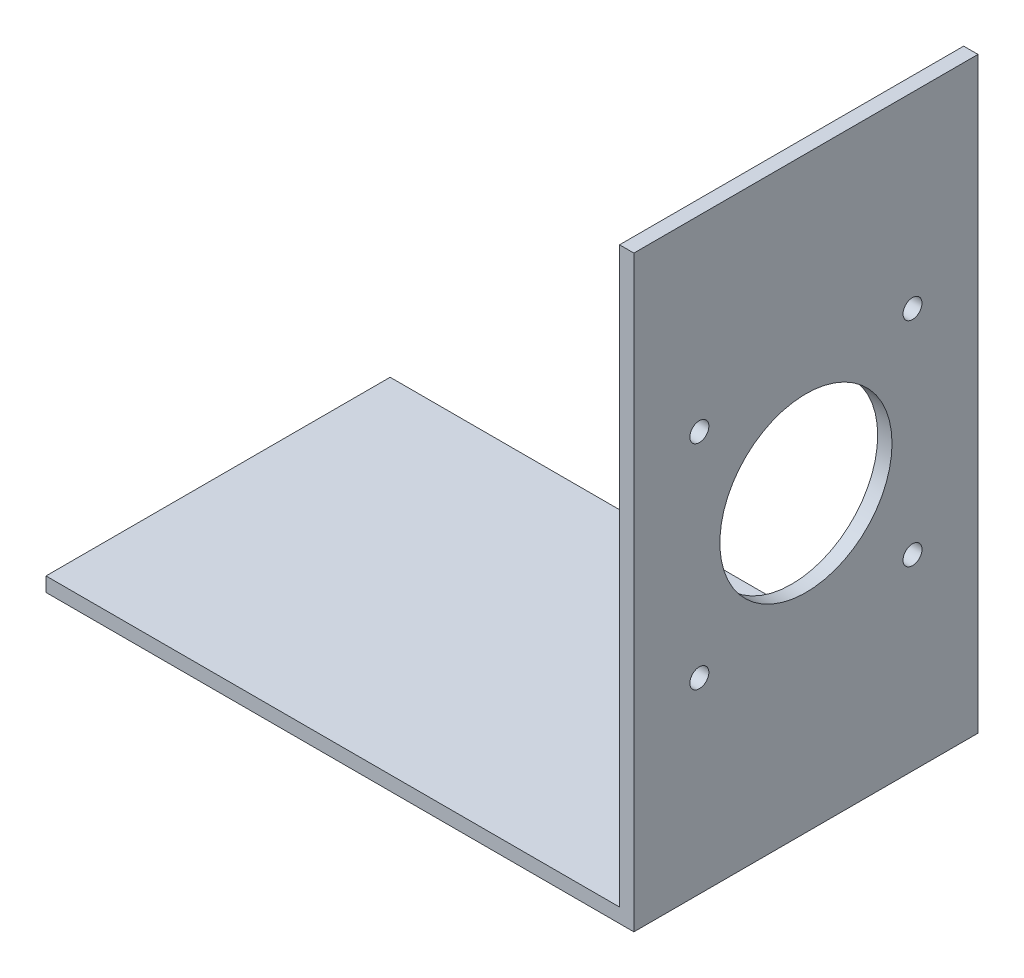
ISO-10303-21;
HEADER;
FILE_DESCRIPTION(('STEP AP214'),'2;1');
FILE_NAME('part.step','',(''),(''),'','','');
FILE_SCHEMA(('AUTOMOTIVE_DESIGN { 1 0 10303 214 1 1 1 1 }'));
ENDSEC;
DATA;
#1=APPLICATION_CONTEXT('core data for automotive mechanical design processes');
#2=APPLICATION_PROTOCOL_DEFINITION('international standard','automotive_design',2000,#1);
#3=PRODUCT_CONTEXT('',#1,'mechanical');
#4=PRODUCT('Part','Part','',(#3));
#5=PRODUCT_RELATED_PRODUCT_CATEGORY('part','',(#4));
#6=PRODUCT_DEFINITION_FORMATION('','',#4);
#7=PRODUCT_DEFINITION_CONTEXT('part definition',#1,'design');
#8=PRODUCT_DEFINITION('design','',#6,#7);
#9=PRODUCT_DEFINITION_SHAPE('','',#8);
#10=(LENGTH_UNIT() NAMED_UNIT(*) SI_UNIT(.MILLI.,.METRE.));
#11=(NAMED_UNIT(*) PLANE_ANGLE_UNIT() SI_UNIT($,.RADIAN.));
#12=(NAMED_UNIT(*) SI_UNIT($,.STERADIAN.) SOLID_ANGLE_UNIT());
#13=UNCERTAINTY_MEASURE_WITH_UNIT(LENGTH_MEASURE(1.E-05),#10,'distance_accuracy_value','');
#14=(GEOMETRIC_REPRESENTATION_CONTEXT(3) GLOBAL_UNCERTAINTY_ASSIGNED_CONTEXT((#13)) GLOBAL_UNIT_ASSIGNED_CONTEXT((#10,
#11,#12)) REPRESENTATION_CONTEXT('',''));
#15=CARTESIAN_POINT('',(0.,0.,0.));
#16=DIRECTION('',(0.,0.,1.));
#17=DIRECTION('',(1.,0.,0.));
#18=AXIS2_PLACEMENT_3D('',#15,#16,#17);
#19=CARTESIAN_POINT('',(130.175,0.,76.2));
#20=DIRECTION('',(-1.,0.,0.));
#21=DIRECTION('',(0.,0.,1.));
#22=AXIS2_PLACEMENT_3D('',#19,#20,#21);
#23=PLANE('',#22);
#24=CARTESIAN_POINT('',(130.175,61.9125,38.1));
#25=DIRECTION('',(1.,0.,0.));
#26=DIRECTION('',(0.,0.,-1.));
#27=AXIS2_PLACEMENT_3D('',#24,#25,#26);
#28=CIRCLE('',#27,19.0627);
#29=CARTESIAN_POINT('',(130.175,61.9125,19.0373));
#30=VERTEX_POINT('',#29);
#31=EDGE_CURVE('E190',#30,#30,#28,.T.);
#32=ORIENTED_EDGE('',*,*,#31,.F.);
#33=EDGE_LOOP('',(#32));
#34=FACE_BOUND('',#33,.T.);
#35=CARTESIAN_POINT('',(130.175,85.5124999999945,14.5));
#36=DIRECTION('',(1.,0.,0.));
#37=DIRECTION('',(0.,0.,-1.));
#38=AXIS2_PLACEMENT_3D('',#35,#36,#37);
#39=CIRCLE('',#38,2.1);
#40=CARTESIAN_POINT('',(130.175,85.5124999999945,12.4));
#41=VERTEX_POINT('',#40);
#42=EDGE_CURVE('E194',#41,#41,#39,.T.);
#43=ORIENTED_EDGE('',*,*,#42,.F.);
#44=EDGE_LOOP('',(#43));
#45=FACE_BOUND('',#44,.T.);
#46=CARTESIAN_POINT('',(130.175,38.3125000000055,61.7));
#47=DIRECTION('',(1.,0.,0.));
#48=DIRECTION('',(0.,0.,-1.));
#49=AXIS2_PLACEMENT_3D('',#46,#47,#48);
#50=CIRCLE('',#49,2.1);
#51=CARTESIAN_POINT('',(130.175,38.3125000000055,59.6));
#52=VERTEX_POINT('',#51);
#53=EDGE_CURVE('E155',#52,#52,#50,.T.);
#54=ORIENTED_EDGE('',*,*,#53,.F.);
#55=EDGE_LOOP('',(#54));
#56=FACE_BOUND('',#55,.T.);
#57=CARTESIAN_POINT('',(130.175,85.5124999999945,61.7));
#58=DIRECTION('',(1.,0.,0.));
#59=DIRECTION('',(0.,0.,-1.));
#60=AXIS2_PLACEMENT_3D('',#57,#58,#59);
#61=CIRCLE('',#60,2.1);
#62=CARTESIAN_POINT('',(130.175,85.5124999999945,59.6));
#63=VERTEX_POINT('',#62);
#64=EDGE_CURVE('E144',#63,#63,#61,.T.);
#65=ORIENTED_EDGE('',*,*,#64,.F.);
#66=EDGE_LOOP('',(#65));
#67=FACE_BOUND('',#66,.T.);
#68=CARTESIAN_POINT('',(130.175,38.3125000000055,14.5));
#69=DIRECTION('',(1.,0.,0.));
#70=DIRECTION('',(0.,0.,-1.));
#71=AXIS2_PLACEMENT_3D('',#68,#69,#70);
#72=CIRCLE('',#71,2.1);
#73=CARTESIAN_POINT('',(130.175,38.3125000000055,12.4));
#74=VERTEX_POINT('',#73);
#75=EDGE_CURVE('E141',#74,#74,#72,.T.);
#76=ORIENTED_EDGE('',*,*,#75,.F.);
#77=EDGE_LOOP('',(#76));
#78=FACE_BOUND('',#77,.T.);
#79=DIRECTION('',(0.,1.,0.));
#80=VECTOR('',#79,1.);
#81=CARTESIAN_POINT('',(130.175,0.,0.));
#82=LINE('',#81,#80);
#83=CARTESIAN_POINT('',(130.175,-3.175,0.));
#84=VERTEX_POINT('',#83);
#85=CARTESIAN_POINT('',(130.175,127.,0.));
#86=VERTEX_POINT('',#85);
#87=EDGE_CURVE('E122',#84,#86,#82,.T.);
#88=ORIENTED_EDGE('',*,*,#87,.T.);
#89=DIRECTION('',(0.,0.,-1.));
#90=VECTOR('',#89,1.);
#91=CARTESIAN_POINT('',(130.175,127.,76.2));
#92=LINE('',#91,#90);
#93=CARTESIAN_POINT('',(130.175,127.,76.2));
#94=VERTEX_POINT('',#93);
#95=EDGE_CURVE('E11',#94,#86,#92,.T.);
#96=ORIENTED_EDGE('',*,*,#95,.F.);
#97=DIRECTION('',(0.,1.,0.));
#98=VECTOR('',#97,1.);
#99=CARTESIAN_POINT('',(130.175,0.,76.2));
#100=LINE('',#99,#98);
#101=CARTESIAN_POINT('',(130.175,-3.175,76.2));
#102=VERTEX_POINT('',#101);
#103=EDGE_CURVE('E87',#102,#94,#100,.T.);
#104=ORIENTED_EDGE('',*,*,#103,.F.);
#105=DIRECTION('',(0.,0.,-1.));
#106=VECTOR('',#105,1.);
#107=CARTESIAN_POINT('',(130.175,-3.175,76.2));
#108=LINE('',#107,#106);
#109=EDGE_CURVE('E118',#102,#84,#108,.T.);
#110=ORIENTED_EDGE('',*,*,#109,.T.);
#111=EDGE_LOOP('',(#88,#96,#104,#110));
#112=FACE_BOUND('',#111,.T.);
#113=ADVANCED_FACE('F39',(#34,#45,#56,#67,#78,#112),#23,.F.);
#114=CARTESIAN_POINT('',(127.,127.,76.2));
#115=DIRECTION('',(0.,1.,0.));
#116=DIRECTION('',(0.,0.,1.));
#117=AXIS2_PLACEMENT_3D('',#114,#115,#116);
#118=PLANE('',#117);
#119=DIRECTION('',(1.,0.,0.));
#120=VECTOR('',#119,1.);
#121=CARTESIAN_POINT('',(127.,127.,0.));
#122=LINE('',#121,#120);
#123=CARTESIAN_POINT('',(127.,127.,0.));
#124=VERTEX_POINT('',#123);
#125=EDGE_CURVE('E125',#124,#86,#122,.T.);
#126=ORIENTED_EDGE('',*,*,#125,.F.);
#127=DIRECTION('',(0.,0.,-1.));
#128=VECTOR('',#127,1.);
#129=CARTESIAN_POINT('',(127.,127.,76.2));
#130=LINE('',#129,#128);
#131=CARTESIAN_POINT('',(127.,127.,76.2));
#132=VERTEX_POINT('',#131);
#133=EDGE_CURVE('E48',#132,#124,#130,.T.);
#134=ORIENTED_EDGE('',*,*,#133,.F.);
#135=DIRECTION('',(1.,0.,0.));
#136=VECTOR('',#135,1.);
#137=CARTESIAN_POINT('',(127.,127.,76.2));
#138=LINE('',#137,#136);
#139=EDGE_CURVE('E160',#132,#94,#138,.T.);
#140=ORIENTED_EDGE('',*,*,#139,.T.);
#141=ORIENTED_EDGE('',*,*,#95,.T.);
#142=EDGE_LOOP('',(#126,#134,#140,#141));
#143=FACE_BOUND('',#142,.T.);
#144=ADVANCED_FACE('F181',(#143),#118,.T.);
#145=CARTESIAN_POINT('',(127.,0.,76.2));
#146=DIRECTION('',(-1.,0.,0.));
#147=DIRECTION('',(0.,0.,1.));
#148=AXIS2_PLACEMENT_3D('',#145,#146,#147);
#149=PLANE('',#148);
#150=CARTESIAN_POINT('',(127.,61.9125,38.1));
#151=DIRECTION('',(-1.,0.,0.));
#152=DIRECTION('',(0.,0.,1.));
#153=AXIS2_PLACEMENT_3D('',#150,#151,#152);
#154=CIRCLE('',#153,19.0627);
#155=CARTESIAN_POINT('',(127.,61.9125,57.1627));
#156=VERTEX_POINT('',#155);
#157=EDGE_CURVE('E42',#156,#156,#154,.T.);
#158=ORIENTED_EDGE('',*,*,#157,.F.);
#159=EDGE_LOOP('',(#158));
#160=FACE_BOUND('',#159,.T.);
#161=CARTESIAN_POINT('',(127.,85.5124999999945,14.5));
#162=DIRECTION('',(-1.,0.,0.));
#163=DIRECTION('',(0.,0.,1.));
#164=AXIS2_PLACEMENT_3D('',#161,#162,#163);
#165=CIRCLE('',#164,2.1);
#166=CARTESIAN_POINT('',(127.,85.5124999999945,16.6));
#167=VERTEX_POINT('',#166);
#168=EDGE_CURVE('E231',#167,#167,#165,.T.);
#169=ORIENTED_EDGE('',*,*,#168,.F.);
#170=EDGE_LOOP('',(#169));
#171=FACE_BOUND('',#170,.T.);
#172=CARTESIAN_POINT('',(127.,38.3125000000055,61.7));
#173=DIRECTION('',(-1.,0.,0.));
#174=DIRECTION('',(0.,0.,1.));
#175=AXIS2_PLACEMENT_3D('',#172,#173,#174);
#176=CIRCLE('',#175,2.1);
#177=CARTESIAN_POINT('',(127.,38.3125000000055,63.8));
#178=VERTEX_POINT('',#177);
#179=EDGE_CURVE('E150',#178,#178,#176,.T.);
#180=ORIENTED_EDGE('',*,*,#179,.F.);
#181=EDGE_LOOP('',(#180));
#182=FACE_BOUND('',#181,.T.);
#183=CARTESIAN_POINT('',(127.,85.5124999999945,61.7));
#184=DIRECTION('',(-1.,0.,0.));
#185=DIRECTION('',(0.,0.,1.));
#186=AXIS2_PLACEMENT_3D('',#183,#184,#185);
#187=CIRCLE('',#186,2.1);
#188=CARTESIAN_POINT('',(127.,85.5124999999945,63.8));
#189=VERTEX_POINT('',#188);
#190=EDGE_CURVE('E142',#189,#189,#187,.T.);
#191=ORIENTED_EDGE('',*,*,#190,.F.);
#192=EDGE_LOOP('',(#191));
#193=FACE_BOUND('',#192,.T.);
#194=CARTESIAN_POINT('',(127.,38.3125000000055,14.5));
#195=DIRECTION('',(-1.,0.,0.));
#196=DIRECTION('',(0.,0.,1.));
#197=AXIS2_PLACEMENT_3D('',#194,#195,#196);
#198=CIRCLE('',#197,2.1);
#199=CARTESIAN_POINT('',(127.,38.3125000000055,16.6));
#200=VERTEX_POINT('',#199);
#201=EDGE_CURVE('E126',#200,#200,#198,.T.);
#202=ORIENTED_EDGE('',*,*,#201,.F.);
#203=EDGE_LOOP('',(#202));
#204=FACE_BOUND('',#203,.T.);
#205=DIRECTION('',(0.,1.,0.));
#206=VECTOR('',#205,1.);
#207=CARTESIAN_POINT('',(127.,0.,0.));
#208=LINE('',#207,#206);
#209=CARTESIAN_POINT('',(127.,0.,0.));
#210=VERTEX_POINT('',#209);
#211=EDGE_CURVE('E129',#210,#124,#208,.T.);
#212=ORIENTED_EDGE('',*,*,#211,.F.);
#213=DIRECTION('',(0.,0.,-1.));
#214=VECTOR('',#213,1.);
#215=CARTESIAN_POINT('',(127.,0.,76.2));
#216=LINE('',#215,#214);
#217=CARTESIAN_POINT('',(127.,0.,76.2));
#218=VERTEX_POINT('',#217);
#219=EDGE_CURVE('E108',#218,#210,#216,.T.);
#220=ORIENTED_EDGE('',*,*,#219,.F.);
#221=DIRECTION('',(0.,1.,0.));
#222=VECTOR('',#221,1.);
#223=CARTESIAN_POINT('',(127.,0.,76.2));
#224=LINE('',#223,#222);
#225=EDGE_CURVE('E114',#218,#132,#224,.T.);
#226=ORIENTED_EDGE('',*,*,#225,.T.);
#227=ORIENTED_EDGE('',*,*,#133,.T.);
#228=EDGE_LOOP('',(#212,#220,#226,#227));
#229=FACE_BOUND('',#228,.T.);
#230=ADVANCED_FACE('F164',(#160,#171,#182,#193,#204,#229),#149,.T.);
#231=CARTESIAN_POINT('',(0.,0.,76.2));
#232=DIRECTION('',(0.,1.,0.));
#233=DIRECTION('',(0.,0.,1.));
#234=AXIS2_PLACEMENT_3D('',#231,#232,#233);
#235=PLANE('',#234);
#236=DIRECTION('',(1.,0.,0.));
#237=VECTOR('',#236,1.);
#238=CARTESIAN_POINT('',(0.,0.,0.));
#239=LINE('',#238,#237);
#240=CARTESIAN_POINT('',(0.,0.,0.));
#241=VERTEX_POINT('',#240);
#242=EDGE_CURVE('E103',#241,#210,#239,.T.);
#243=ORIENTED_EDGE('',*,*,#242,.F.);
#244=DIRECTION('',(0.,0.,-1.));
#245=VECTOR('',#244,1.);
#246=CARTESIAN_POINT('',(0.,0.,76.2));
#247=LINE('',#246,#245);
#248=CARTESIAN_POINT('',(0.,0.,76.2));
#249=VERTEX_POINT('',#248);
#250=EDGE_CURVE('E98',#249,#241,#247,.T.);
#251=ORIENTED_EDGE('',*,*,#250,.F.);
#252=DIRECTION('',(1.,0.,0.));
#253=VECTOR('',#252,1.);
#254=CARTESIAN_POINT('',(0.,0.,76.2));
#255=LINE('',#254,#253);
#256=EDGE_CURVE('E101',#249,#218,#255,.T.);
#257=ORIENTED_EDGE('',*,*,#256,.T.);
#258=ORIENTED_EDGE('',*,*,#219,.T.);
#259=EDGE_LOOP('',(#243,#251,#257,#258));
#260=FACE_BOUND('',#259,.T.);
#261=ADVANCED_FACE('F100',(#260),#235,.T.);
#262=CARTESIAN_POINT('',(0.,-3.175,76.2));
#263=DIRECTION('',(-1.,0.,0.));
#264=DIRECTION('',(0.,0.,1.));
#265=AXIS2_PLACEMENT_3D('',#262,#263,#264);
#266=PLANE('',#265);
#267=DIRECTION('',(0.,1.,0.));
#268=VECTOR('',#267,1.);
#269=CARTESIAN_POINT('',(0.,-3.175,0.));
#270=LINE('',#269,#268);
#271=CARTESIAN_POINT('',(0.,-3.175,0.));
#272=VERTEX_POINT('',#271);
#273=EDGE_CURVE('E133',#272,#241,#270,.T.);
#274=ORIENTED_EDGE('',*,*,#273,.F.);
#275=DIRECTION('',(0.,0.,-1.));
#276=VECTOR('',#275,1.);
#277=CARTESIAN_POINT('',(0.,-3.175,76.2));
#278=LINE('',#277,#276);
#279=CARTESIAN_POINT('',(0.,-3.175,76.2));
#280=VERTEX_POINT('',#279);
#281=EDGE_CURVE('E78',#280,#272,#278,.T.);
#282=ORIENTED_EDGE('',*,*,#281,.F.);
#283=DIRECTION('',(0.,1.,0.));
#284=VECTOR('',#283,1.);
#285=CARTESIAN_POINT('',(0.,-3.175,76.2));
#286=LINE('',#285,#284);
#287=EDGE_CURVE('E112',#280,#249,#286,.T.);
#288=ORIENTED_EDGE('',*,*,#287,.T.);
#289=ORIENTED_EDGE('',*,*,#250,.T.);
#290=EDGE_LOOP('',(#274,#282,#288,#289));
#291=FACE_BOUND('',#290,.T.);
#292=ADVANCED_FACE('F116',(#291),#266,.T.);
#293=CARTESIAN_POINT('',(0.,-3.175,76.2));
#294=DIRECTION('',(0.,1.,0.));
#295=DIRECTION('',(0.,0.,1.));
#296=AXIS2_PLACEMENT_3D('',#293,#294,#295);
#297=PLANE('',#296);
#298=DIRECTION('',(1.,0.,0.));
#299=VECTOR('',#298,1.);
#300=CARTESIAN_POINT('',(0.,-3.175,0.));
#301=LINE('',#300,#299);
#302=EDGE_CURVE('E81',#272,#84,#301,.T.);
#303=ORIENTED_EDGE('',*,*,#302,.T.);
#304=ORIENTED_EDGE('',*,*,#109,.F.);
#305=DIRECTION('',(1.,0.,0.));
#306=VECTOR('',#305,1.);
#307=CARTESIAN_POINT('',(0.,-3.175,76.2));
#308=LINE('',#307,#306);
#309=EDGE_CURVE('E57',#280,#102,#308,.T.);
#310=ORIENTED_EDGE('',*,*,#309,.F.);
#311=ORIENTED_EDGE('',*,*,#281,.T.);
#312=EDGE_LOOP('',(#303,#304,#310,#311));
#313=FACE_BOUND('',#312,.T.);
#314=ADVANCED_FACE('F170',(#313),#297,.F.);
#315=CARTESIAN_POINT('',(0.,0.,76.2));
#316=DIRECTION('',(0.,0.,-1.));
#317=DIRECTION('',(-1.,0.,0.));
#318=AXIS2_PLACEMENT_3D('',#315,#316,#317);
#319=PLANE('',#318);
#320=ORIENTED_EDGE('',*,*,#103,.T.);
#321=ORIENTED_EDGE('',*,*,#139,.F.);
#322=ORIENTED_EDGE('',*,*,#225,.F.);
#323=ORIENTED_EDGE('',*,*,#256,.F.);
#324=ORIENTED_EDGE('',*,*,#287,.F.);
#325=ORIENTED_EDGE('',*,*,#309,.T.);
#326=EDGE_LOOP('',(#320,#321,#322,#323,#324,#325));
#327=FACE_BOUND('',#326,.T.);
#328=ADVANCED_FACE('F111',(#327),#319,.F.);
#329=CARTESIAN_POINT('',(0.,0.,0.));
#330=DIRECTION('',(0.,0.,-1.));
#331=DIRECTION('',(-1.,0.,0.));
#332=AXIS2_PLACEMENT_3D('',#329,#330,#331);
#333=PLANE('',#332);
#334=ORIENTED_EDGE('',*,*,#87,.F.);
#335=ORIENTED_EDGE('',*,*,#302,.F.);
#336=ORIENTED_EDGE('',*,*,#273,.T.);
#337=ORIENTED_EDGE('',*,*,#242,.T.);
#338=ORIENTED_EDGE('',*,*,#211,.T.);
#339=ORIENTED_EDGE('',*,*,#125,.T.);
#340=EDGE_LOOP('',(#334,#335,#336,#337,#338,#339));
#341=FACE_BOUND('',#340,.T.);
#342=ADVANCED_FACE('F168',(#341),#333,.T.);
#343=CARTESIAN_POINT('',(130.175,38.3125000000055,14.5));
#344=DIRECTION('',(1.,0.,0.));
#345=DIRECTION('',(0.,0.,-1.));
#346=AXIS2_PLACEMENT_3D('',#343,#344,#345);
#347=CYLINDRICAL_SURFACE('',#346,2.1);
#348=ORIENTED_EDGE('',*,*,#201,.T.);
#349=EDGE_LOOP('',(#348));
#350=FACE_BOUND('',#349,.T.);
#351=ORIENTED_EDGE('',*,*,#75,.T.);
#352=EDGE_LOOP('',(#351));
#353=FACE_BOUND('',#352,.T.);
#354=ADVANCED_FACE('F201',(#350,#353),#347,.F.);
#355=CARTESIAN_POINT('',(130.175,85.5124999999945,61.7));
#356=DIRECTION('',(1.,0.,0.));
#357=DIRECTION('',(0.,0.,-1.));
#358=AXIS2_PLACEMENT_3D('',#355,#356,#357);
#359=CYLINDRICAL_SURFACE('',#358,2.1);
#360=ORIENTED_EDGE('',*,*,#190,.T.);
#361=EDGE_LOOP('',(#360));
#362=FACE_BOUND('',#361,.T.);
#363=ORIENTED_EDGE('',*,*,#64,.T.);
#364=EDGE_LOOP('',(#363));
#365=FACE_BOUND('',#364,.T.);
#366=ADVANCED_FACE('F203',(#362,#365),#359,.F.);
#367=CARTESIAN_POINT('',(130.175,38.3125000000055,61.7));
#368=DIRECTION('',(1.,0.,0.));
#369=DIRECTION('',(0.,0.,-1.));
#370=AXIS2_PLACEMENT_3D('',#367,#368,#369);
#371=CYLINDRICAL_SURFACE('',#370,2.1);
#372=ORIENTED_EDGE('',*,*,#179,.T.);
#373=EDGE_LOOP('',(#372));
#374=FACE_BOUND('',#373,.T.);
#375=ORIENTED_EDGE('',*,*,#53,.T.);
#376=EDGE_LOOP('',(#375));
#377=FACE_BOUND('',#376,.T.);
#378=ADVANCED_FACE('F210',(#374,#377),#371,.F.);
#379=CARTESIAN_POINT('',(130.175,85.5124999999945,14.5));
#380=DIRECTION('',(1.,0.,0.));
#381=DIRECTION('',(0.,0.,-1.));
#382=AXIS2_PLACEMENT_3D('',#379,#380,#381);
#383=CYLINDRICAL_SURFACE('',#382,2.1);
#384=ORIENTED_EDGE('',*,*,#168,.T.);
#385=EDGE_LOOP('',(#384));
#386=FACE_BOUND('',#385,.T.);
#387=ORIENTED_EDGE('',*,*,#42,.T.);
#388=EDGE_LOOP('',(#387));
#389=FACE_BOUND('',#388,.T.);
#390=ADVANCED_FACE('F215',(#386,#389),#383,.F.);
#391=CARTESIAN_POINT('',(0.,61.9125,38.1));
#392=DIRECTION('',(1.,0.,0.));
#393=DIRECTION('',(0.,0.,-1.));
#394=AXIS2_PLACEMENT_3D('',#391,#392,#393);
#395=CYLINDRICAL_SURFACE('',#394,19.0627);
#396=ORIENTED_EDGE('',*,*,#157,.T.);
#397=EDGE_LOOP('',(#396));
#398=FACE_BOUND('',#397,.T.);
#399=ORIENTED_EDGE('',*,*,#31,.T.);
#400=EDGE_LOOP('',(#399));
#401=FACE_BOUND('',#400,.T.);
#402=ADVANCED_FACE('F219',(#398,#401),#395,.F.);
#403=CLOSED_SHELL('',(#113,#144,#230,#261,#292,#314,#328,#342,#354,#366,#378,#390,#402));
#404=MANIFOLD_SOLID_BREP('B2',#403);
#405=ADVANCED_BREP_SHAPE_REPRESENTATION('',(#18,#404),#14);
#406=SHAPE_DEFINITION_REPRESENTATION(#9,#405);
ENDSEC;
END-ISO-10303-21;
